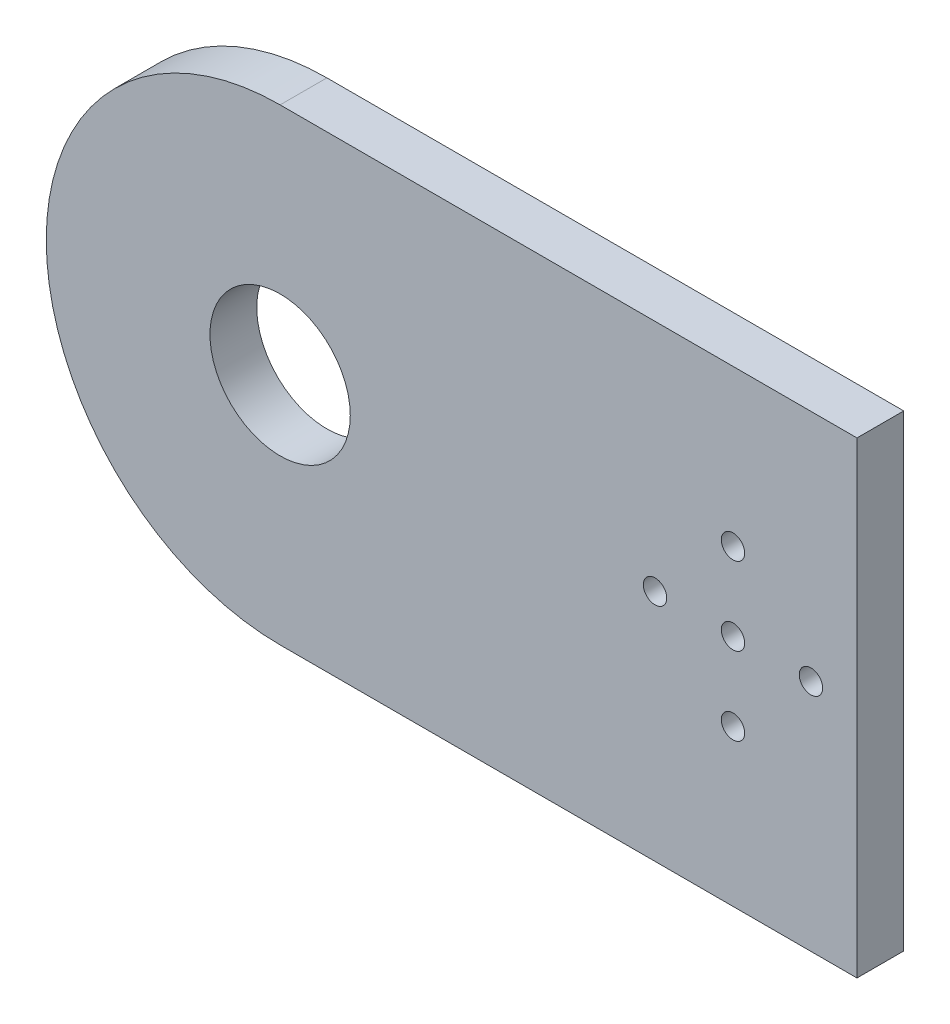
ISO-10303-21;
HEADER;
FILE_DESCRIPTION(('STEP AP214'),'2;1');
FILE_NAME('part.step','',(''),(''),'','','');
FILE_SCHEMA(('AUTOMOTIVE_DESIGN { 1 0 10303 214 1 1 1 1 }'));
ENDSEC;
DATA;
#1=APPLICATION_CONTEXT('core data for automotive mechanical design processes');
#2=APPLICATION_PROTOCOL_DEFINITION('international standard','automotive_design',2000,#1);
#3=PRODUCT_CONTEXT('',#1,'mechanical');
#4=PRODUCT('Part','Part','',(#3));
#5=PRODUCT_RELATED_PRODUCT_CATEGORY('part','',(#4));
#6=PRODUCT_DEFINITION_FORMATION('','',#4);
#7=PRODUCT_DEFINITION_CONTEXT('part definition',#1,'design');
#8=PRODUCT_DEFINITION('design','',#6,#7);
#9=PRODUCT_DEFINITION_SHAPE('','',#8);
#10=(LENGTH_UNIT() NAMED_UNIT(*) SI_UNIT(.MILLI.,.METRE.));
#11=(NAMED_UNIT(*) PLANE_ANGLE_UNIT() SI_UNIT($,.RADIAN.));
#12=(NAMED_UNIT(*) SI_UNIT($,.STERADIAN.) SOLID_ANGLE_UNIT());
#13=UNCERTAINTY_MEASURE_WITH_UNIT(LENGTH_MEASURE(1.E-05),#10,'distance_accuracy_value','');
#14=(GEOMETRIC_REPRESENTATION_CONTEXT(3) GLOBAL_UNCERTAINTY_ASSIGNED_CONTEXT((#13)) GLOBAL_UNIT_ASSIGNED_CONTEXT((#10,
#11,#12)) REPRESENTATION_CONTEXT('',''));
#15=CARTESIAN_POINT('',(0.,0.,0.));
#16=DIRECTION('',(0.,0.,1.));
#17=DIRECTION('',(1.,0.,0.));
#18=AXIS2_PLACEMENT_3D('',#15,#16,#17);
#19=CARTESIAN_POINT('',(37.,30.,6.));
#20=DIRECTION('',(-1.,0.,0.));
#21=DIRECTION('',(0.,-1.,0.));
#22=AXIS2_PLACEMENT_3D('',#19,#20,#21);
#23=PLANE('',#22);
#24=DIRECTION('',(0.,1.,0.));
#25=VECTOR('',#24,1.);
#26=CARTESIAN_POINT('',(37.,30.,0.));
#27=LINE('',#26,#25);
#28=CARTESIAN_POINT('',(37.,-30.,0.));
#29=VERTEX_POINT('',#28);
#30=CARTESIAN_POINT('',(37.,30.,0.));
#31=VERTEX_POINT('',#30);
#32=EDGE_CURVE('E100',#29,#31,#27,.T.);
#33=ORIENTED_EDGE('',*,*,#32,.T.);
#34=DIRECTION('',(0.,0.,-1.));
#35=VECTOR('',#34,1.);
#36=CARTESIAN_POINT('',(37.,30.,6.));
#37=LINE('',#36,#35);
#38=CARTESIAN_POINT('',(37.,30.,6.));
#39=VERTEX_POINT('',#38);
#40=EDGE_CURVE('E11',#39,#31,#37,.T.);
#41=ORIENTED_EDGE('',*,*,#40,.F.);
#42=DIRECTION('',(0.,1.,0.));
#43=VECTOR('',#42,1.);
#44=CARTESIAN_POINT('',(37.,30.,6.));
#45=LINE('',#44,#43);
#46=CARTESIAN_POINT('',(37.,-30.,6.));
#47=VERTEX_POINT('',#46);
#48=EDGE_CURVE('E88',#47,#39,#45,.T.);
#49=ORIENTED_EDGE('',*,*,#48,.F.);
#50=DIRECTION('',(0.,0.,-1.));
#51=VECTOR('',#50,1.);
#52=CARTESIAN_POINT('',(37.,-30.,6.));
#53=LINE('',#52,#51);
#54=EDGE_CURVE('E96',#47,#29,#53,.T.);
#55=ORIENTED_EDGE('',*,*,#54,.T.);
#56=EDGE_LOOP('',(#33,#41,#49,#55));
#57=FACE_BOUND('',#56,.T.);
#58=ADVANCED_FACE('F37',(#57),#23,.F.);
#59=CARTESIAN_POINT('',(-37.,30.,6.));
#60=DIRECTION('',(0.,-1.,0.));
#61=DIRECTION('',(1.,0.,0.));
#62=AXIS2_PLACEMENT_3D('',#59,#60,#61);
#63=PLANE('',#62);
#64=DIRECTION('',(-1.,0.,0.));
#65=VECTOR('',#64,1.);
#66=CARTESIAN_POINT('',(-37.,30.,0.));
#67=LINE('',#66,#65);
#68=CARTESIAN_POINT('',(-37.,30.,0.));
#69=VERTEX_POINT('',#68);
#70=EDGE_CURVE('E92',#31,#69,#67,.T.);
#71=ORIENTED_EDGE('',*,*,#70,.T.);
#72=DIRECTION('',(0.,0.,-1.));
#73=VECTOR('',#72,1.);
#74=CARTESIAN_POINT('',(-37.,30.,6.));
#75=LINE('',#74,#73);
#76=CARTESIAN_POINT('',(-37.,30.,6.));
#77=VERTEX_POINT('',#76);
#78=EDGE_CURVE('E45',#77,#69,#75,.T.);
#79=ORIENTED_EDGE('',*,*,#78,.F.);
#80=DIRECTION('',(-1.,0.,0.));
#81=VECTOR('',#80,1.);
#82=CARTESIAN_POINT('',(-37.,30.,6.));
#83=LINE('',#82,#81);
#84=EDGE_CURVE('E83',#39,#77,#83,.T.);
#85=ORIENTED_EDGE('',*,*,#84,.F.);
#86=ORIENTED_EDGE('',*,*,#40,.T.);
#87=EDGE_LOOP('',(#71,#79,#85,#86));
#88=FACE_BOUND('',#87,.T.);
#89=ADVANCED_FACE('F91',(#88),#63,.F.);
#90=CARTESIAN_POINT('',(-37.,0.,6.));
#91=DIRECTION('',(0.,0.,-1.));
#92=DIRECTION('',(-1.,0.,0.));
#93=AXIS2_PLACEMENT_3D('',#90,#91,#92);
#94=CYLINDRICAL_SURFACE('',#93,30.);
#95=CARTESIAN_POINT('',(-37.,0.,0.));
#96=DIRECTION('',(0.,0.,1.));
#97=DIRECTION('',(1.,0.,0.));
#98=AXIS2_PLACEMENT_3D('',#95,#96,#97);
#99=CIRCLE('',#98,30.);
#100=CARTESIAN_POINT('',(-37.,-30.,0.));
#101=VERTEX_POINT('',#100);
#102=EDGE_CURVE('E70',#69,#101,#99,.T.);
#103=ORIENTED_EDGE('',*,*,#102,.T.);
#104=DIRECTION('',(0.,0.,-1.));
#105=VECTOR('',#104,1.);
#106=CARTESIAN_POINT('',(-37.,-30.,6.));
#107=LINE('',#106,#105);
#108=CARTESIAN_POINT('',(-37.,-30.,6.));
#109=VERTEX_POINT('',#108);
#110=EDGE_CURVE('E93',#109,#101,#107,.T.);
#111=ORIENTED_EDGE('',*,*,#110,.F.);
#112=CARTESIAN_POINT('',(-37.,0.,6.));
#113=DIRECTION('',(0.,0.,1.));
#114=DIRECTION('',(1.,0.,0.));
#115=AXIS2_PLACEMENT_3D('',#112,#113,#114);
#116=CIRCLE('',#115,30.);
#117=EDGE_CURVE('E86',#77,#109,#116,.T.);
#118=ORIENTED_EDGE('',*,*,#117,.F.);
#119=ORIENTED_EDGE('',*,*,#78,.T.);
#120=EDGE_LOOP('',(#103,#111,#118,#119));
#121=FACE_BOUND('',#120,.T.);
#122=ADVANCED_FACE('F94',(#121),#94,.T.);
#123=CARTESIAN_POINT('',(-37.,-30.,6.));
#124=DIRECTION('',(0.,1.,0.));
#125=DIRECTION('',(0.,0.,1.));
#126=AXIS2_PLACEMENT_3D('',#123,#124,#125);
#127=PLANE('',#126);
#128=DIRECTION('',(1.,0.,0.));
#129=VECTOR('',#128,1.);
#130=CARTESIAN_POINT('',(-37.,-30.,0.));
#131=LINE('',#130,#129);
#132=EDGE_CURVE('E76',#101,#29,#131,.T.);
#133=ORIENTED_EDGE('',*,*,#132,.T.);
#134=ORIENTED_EDGE('',*,*,#54,.F.);
#135=DIRECTION('',(1.,0.,0.));
#136=VECTOR('',#135,1.);
#137=CARTESIAN_POINT('',(-37.,-30.,6.));
#138=LINE('',#137,#136);
#139=EDGE_CURVE('E53',#109,#47,#138,.T.);
#140=ORIENTED_EDGE('',*,*,#139,.F.);
#141=ORIENTED_EDGE('',*,*,#110,.T.);
#142=EDGE_LOOP('',(#133,#134,#140,#141));
#143=FACE_BOUND('',#142,.T.);
#144=ADVANCED_FACE('F108',(#143),#127,.F.);
#145=CARTESIAN_POINT('',(-37.,0.,6.));
#146=DIRECTION('',(0.,0.,1.));
#147=DIRECTION('',(1.,0.,0.));
#148=AXIS2_PLACEMENT_3D('',#145,#146,#147);
#149=PLANE('',#148);
#150=CARTESIAN_POINT('',(-37.,0.,6.));
#151=DIRECTION('',(0.,0.,1.));
#152=DIRECTION('',(1.,0.,0.));
#153=AXIS2_PLACEMENT_3D('',#150,#151,#152);
#154=CIRCLE('',#153,9.);
#155=CARTESIAN_POINT('',(-28.,0.,6.));
#156=VERTEX_POINT('',#155);
#157=EDGE_CURVE('E144',#156,#156,#154,.T.);
#158=ORIENTED_EDGE('',*,*,#157,.F.);
#159=EDGE_LOOP('',(#158));
#160=FACE_BOUND('',#159,.T.);
#161=CARTESIAN_POINT('',(21.0941,-9.99999999999922,6.));
#162=DIRECTION('',(0.,0.,1.));
#163=DIRECTION('',(1.,0.,0.));
#164=AXIS2_PLACEMENT_3D('',#161,#162,#163);
#165=CIRCLE('',#164,1.5);
#166=CARTESIAN_POINT('',(22.5941,-9.99999999999922,6.));
#167=VERTEX_POINT('',#166);
#168=EDGE_CURVE('E127',#167,#167,#165,.T.);
#169=ORIENTED_EDGE('',*,*,#168,.F.);
#170=EDGE_LOOP('',(#169));
#171=FACE_BOUND('',#170,.T.);
#172=CARTESIAN_POINT('',(11.0941,7.8756445809347E-13,6.));
#173=DIRECTION('',(0.,0.,1.));
#174=DIRECTION('',(1.,0.,0.));
#175=AXIS2_PLACEMENT_3D('',#172,#173,#174);
#176=CIRCLE('',#175,1.5);
#177=CARTESIAN_POINT('',(12.5941,7.8756445809347E-13,6.));
#178=VERTEX_POINT('',#177);
#179=EDGE_CURVE('E131',#178,#178,#176,.T.);
#180=ORIENTED_EDGE('',*,*,#179,.F.);
#181=EDGE_LOOP('',(#180));
#182=FACE_BOUND('',#181,.T.);
#183=CARTESIAN_POINT('',(31.0941,7.84095011141517E-13,6.));
#184=DIRECTION('',(0.,0.,1.));
#185=DIRECTION('',(1.,0.,0.));
#186=AXIS2_PLACEMENT_3D('',#183,#184,#185);
#187=CIRCLE('',#186,1.5);
#188=CARTESIAN_POINT('',(32.5941,7.84095011141517E-13,6.));
#189=VERTEX_POINT('',#188);
#190=EDGE_CURVE('E118',#189,#189,#187,.T.);
#191=ORIENTED_EDGE('',*,*,#190,.F.);
#192=EDGE_LOOP('',(#191));
#193=FACE_BOUND('',#192,.T.);
#194=CARTESIAN_POINT('',(21.0941,10.0000000000008,6.));
#195=DIRECTION('',(0.,0.,1.));
#196=DIRECTION('',(1.,0.,0.));
#197=AXIS2_PLACEMENT_3D('',#194,#195,#196);
#198=CIRCLE('',#197,1.5);
#199=CARTESIAN_POINT('',(22.5941,10.0000000000008,6.));
#200=VERTEX_POINT('',#199);
#201=EDGE_CURVE('E117',#200,#200,#198,.T.);
#202=ORIENTED_EDGE('',*,*,#201,.F.);
#203=EDGE_LOOP('',(#202));
#204=FACE_BOUND('',#203,.T.);
#205=CARTESIAN_POINT('',(21.0941,7.8756445809347E-13,6.));
#206=DIRECTION('',(0.,0.,1.));
#207=DIRECTION('',(1.,0.,0.));
#208=AXIS2_PLACEMENT_3D('',#205,#206,#207);
#209=CIRCLE('',#208,1.5);
#210=CARTESIAN_POINT('',(22.5941,7.8756445809347E-13,6.));
#211=VERTEX_POINT('',#210);
#212=EDGE_CURVE('E124',#211,#211,#209,.T.);
#213=ORIENTED_EDGE('',*,*,#212,.F.);
#214=EDGE_LOOP('',(#213));
#215=FACE_BOUND('',#214,.T.);
#216=ORIENTED_EDGE('',*,*,#48,.T.);
#217=ORIENTED_EDGE('',*,*,#84,.T.);
#218=ORIENTED_EDGE('',*,*,#117,.T.);
#219=ORIENTED_EDGE('',*,*,#139,.T.);
#220=EDGE_LOOP('',(#216,#217,#218,#219));
#221=FACE_BOUND('',#220,.T.);
#222=ADVANCED_FACE('F84',(#160,#171,#182,#193,#204,#215,#221),#149,.T.);
#223=CARTESIAN_POINT('',(-37.,0.,0.));
#224=DIRECTION('',(0.,0.,1.));
#225=DIRECTION('',(1.,0.,0.));
#226=AXIS2_PLACEMENT_3D('',#223,#224,#225);
#227=PLANE('',#226);
#228=CARTESIAN_POINT('',(-37.,0.,0.));
#229=DIRECTION('',(0.,0.,1.));
#230=DIRECTION('',(1.,0.,0.));
#231=AXIS2_PLACEMENT_3D('',#228,#229,#230);
#232=CIRCLE('',#231,9.);
#233=CARTESIAN_POINT('',(-28.,0.,0.));
#234=VERTEX_POINT('',#233);
#235=EDGE_CURVE('E132',#234,#234,#232,.T.);
#236=ORIENTED_EDGE('',*,*,#235,.T.);
#237=EDGE_LOOP('',(#236));
#238=FACE_BOUND('',#237,.T.);
#239=CARTESIAN_POINT('',(21.0941,-9.99999999999922,0.));
#240=DIRECTION('',(0.,0.,1.));
#241=DIRECTION('',(1.,0.,0.));
#242=AXIS2_PLACEMENT_3D('',#239,#240,#241);
#243=CIRCLE('',#242,1.5);
#244=CARTESIAN_POINT('',(22.5941,-9.99999999999922,0.));
#245=VERTEX_POINT('',#244);
#246=EDGE_CURVE('E103',#245,#245,#243,.T.);
#247=ORIENTED_EDGE('',*,*,#246,.T.);
#248=EDGE_LOOP('',(#247));
#249=FACE_BOUND('',#248,.T.);
#250=CARTESIAN_POINT('',(11.0941,7.8756445809347E-13,0.));
#251=DIRECTION('',(0.,0.,1.));
#252=DIRECTION('',(1.,0.,0.));
#253=AXIS2_PLACEMENT_3D('',#250,#251,#252);
#254=CIRCLE('',#253,1.5);
#255=CARTESIAN_POINT('',(12.5941,7.8756445809347E-13,0.));
#256=VERTEX_POINT('',#255);
#257=EDGE_CURVE('E128',#256,#256,#254,.T.);
#258=ORIENTED_EDGE('',*,*,#257,.T.);
#259=EDGE_LOOP('',(#258));
#260=FACE_BOUND('',#259,.T.);
#261=CARTESIAN_POINT('',(31.0941,7.84095011141517E-13,0.));
#262=DIRECTION('',(0.,0.,1.));
#263=DIRECTION('',(1.,0.,0.));
#264=AXIS2_PLACEMENT_3D('',#261,#262,#263);
#265=CIRCLE('',#264,1.5);
#266=CARTESIAN_POINT('',(32.5941,7.84095011141517E-13,0.));
#267=VERTEX_POINT('',#266);
#268=EDGE_CURVE('E135',#267,#267,#265,.T.);
#269=ORIENTED_EDGE('',*,*,#268,.T.);
#270=EDGE_LOOP('',(#269));
#271=FACE_BOUND('',#270,.T.);
#272=CARTESIAN_POINT('',(21.0941,10.0000000000008,0.));
#273=DIRECTION('',(0.,0.,1.));
#274=DIRECTION('',(1.,0.,0.));
#275=AXIS2_PLACEMENT_3D('',#272,#273,#274);
#276=CIRCLE('',#275,1.5);
#277=CARTESIAN_POINT('',(22.5941,10.0000000000008,0.));
#278=VERTEX_POINT('',#277);
#279=EDGE_CURVE('E114',#278,#278,#276,.T.);
#280=ORIENTED_EDGE('',*,*,#279,.T.);
#281=EDGE_LOOP('',(#280));
#282=FACE_BOUND('',#281,.T.);
#283=CARTESIAN_POINT('',(21.0941,7.8756445809347E-13,0.));
#284=DIRECTION('',(0.,0.,1.));
#285=DIRECTION('',(1.,0.,0.));
#286=AXIS2_PLACEMENT_3D('',#283,#284,#285);
#287=CIRCLE('',#286,1.5);
#288=CARTESIAN_POINT('',(22.5941,7.8756445809347E-13,0.));
#289=VERTEX_POINT('',#288);
#290=EDGE_CURVE('E121',#289,#289,#287,.T.);
#291=ORIENTED_EDGE('',*,*,#290,.T.);
#292=EDGE_LOOP('',(#291));
#293=FACE_BOUND('',#292,.T.);
#294=ORIENTED_EDGE('',*,*,#32,.F.);
#295=ORIENTED_EDGE('',*,*,#132,.F.);
#296=ORIENTED_EDGE('',*,*,#102,.F.);
#297=ORIENTED_EDGE('',*,*,#70,.F.);
#298=EDGE_LOOP('',(#294,#295,#296,#297));
#299=FACE_BOUND('',#298,.T.);
#300=ADVANCED_FACE('F111',(#238,#249,#260,#271,#282,#293,#299),#227,.F.);
#301=CARTESIAN_POINT('',(21.0941,7.8756445809347E-13,0.));
#302=DIRECTION('',(0.,0.,1.));
#303=DIRECTION('',(1.,0.,0.));
#304=AXIS2_PLACEMENT_3D('',#301,#302,#303);
#305=CYLINDRICAL_SURFACE('',#304,1.5);
#306=ORIENTED_EDGE('',*,*,#290,.F.);
#307=EDGE_LOOP('',(#306));
#308=FACE_BOUND('',#307,.T.);
#309=ORIENTED_EDGE('',*,*,#212,.T.);
#310=EDGE_LOOP('',(#309));
#311=FACE_BOUND('',#310,.T.);
#312=ADVANCED_FACE('F172',(#308,#311),#305,.F.);
#313=CARTESIAN_POINT('',(21.0941,10.0000000000008,0.));
#314=DIRECTION('',(0.,0.,1.));
#315=DIRECTION('',(1.,0.,0.));
#316=AXIS2_PLACEMENT_3D('',#313,#314,#315);
#317=CYLINDRICAL_SURFACE('',#316,1.5);
#318=ORIENTED_EDGE('',*,*,#279,.F.);
#319=EDGE_LOOP('',(#318));
#320=FACE_BOUND('',#319,.T.);
#321=ORIENTED_EDGE('',*,*,#201,.T.);
#322=EDGE_LOOP('',(#321));
#323=FACE_BOUND('',#322,.T.);
#324=ADVANCED_FACE('F174',(#320,#323),#317,.F.);
#325=CARTESIAN_POINT('',(31.0941,7.84095011141517E-13,0.));
#326=DIRECTION('',(0.,0.,1.));
#327=DIRECTION('',(1.,0.,0.));
#328=AXIS2_PLACEMENT_3D('',#325,#326,#327);
#329=CYLINDRICAL_SURFACE('',#328,1.5);
#330=ORIENTED_EDGE('',*,*,#268,.F.);
#331=EDGE_LOOP('',(#330));
#332=FACE_BOUND('',#331,.T.);
#333=ORIENTED_EDGE('',*,*,#190,.T.);
#334=EDGE_LOOP('',(#333));
#335=FACE_BOUND('',#334,.T.);
#336=ADVANCED_FACE('F181',(#332,#335),#329,.F.);
#337=CARTESIAN_POINT('',(11.0941,7.8756445809347E-13,0.));
#338=DIRECTION('',(0.,0.,1.));
#339=DIRECTION('',(1.,0.,0.));
#340=AXIS2_PLACEMENT_3D('',#337,#338,#339);
#341=CYLINDRICAL_SURFACE('',#340,1.5);
#342=ORIENTED_EDGE('',*,*,#257,.F.);
#343=EDGE_LOOP('',(#342));
#344=FACE_BOUND('',#343,.T.);
#345=ORIENTED_EDGE('',*,*,#179,.T.);
#346=EDGE_LOOP('',(#345));
#347=FACE_BOUND('',#346,.T.);
#348=ADVANCED_FACE('F227',(#344,#347),#341,.F.);
#349=CARTESIAN_POINT('',(21.0941,-9.99999999999922,0.));
#350=DIRECTION('',(0.,0.,1.));
#351=DIRECTION('',(1.,0.,0.));
#352=AXIS2_PLACEMENT_3D('',#349,#350,#351);
#353=CYLINDRICAL_SURFACE('',#352,1.5);
#354=ORIENTED_EDGE('',*,*,#246,.F.);
#355=EDGE_LOOP('',(#354));
#356=FACE_BOUND('',#355,.T.);
#357=ORIENTED_EDGE('',*,*,#168,.T.);
#358=EDGE_LOOP('',(#357));
#359=FACE_BOUND('',#358,.T.);
#360=ADVANCED_FACE('F155',(#356,#359),#353,.F.);
#361=CARTESIAN_POINT('',(-37.,0.,0.));
#362=DIRECTION('',(0.,0.,1.));
#363=DIRECTION('',(1.,0.,0.));
#364=AXIS2_PLACEMENT_3D('',#361,#362,#363);
#365=CYLINDRICAL_SURFACE('',#364,9.);
#366=ORIENTED_EDGE('',*,*,#235,.F.);
#367=EDGE_LOOP('',(#366));
#368=FACE_BOUND('',#367,.T.);
#369=ORIENTED_EDGE('',*,*,#157,.T.);
#370=EDGE_LOOP('',(#369));
#371=FACE_BOUND('',#370,.T.);
#372=ADVANCED_FACE('F152',(#368,#371),#365,.F.);
#373=CLOSED_SHELL('',(#58,#89,#122,#144,#222,#300,#312,#324,#336,#348,#360,#372));
#374=MANIFOLD_SOLID_BREP('B2',#373);
#375=ADVANCED_BREP_SHAPE_REPRESENTATION('',(#18,#374),#14);
#376=SHAPE_DEFINITION_REPRESENTATION(#9,#375);
ENDSEC;
END-ISO-10303-21;
